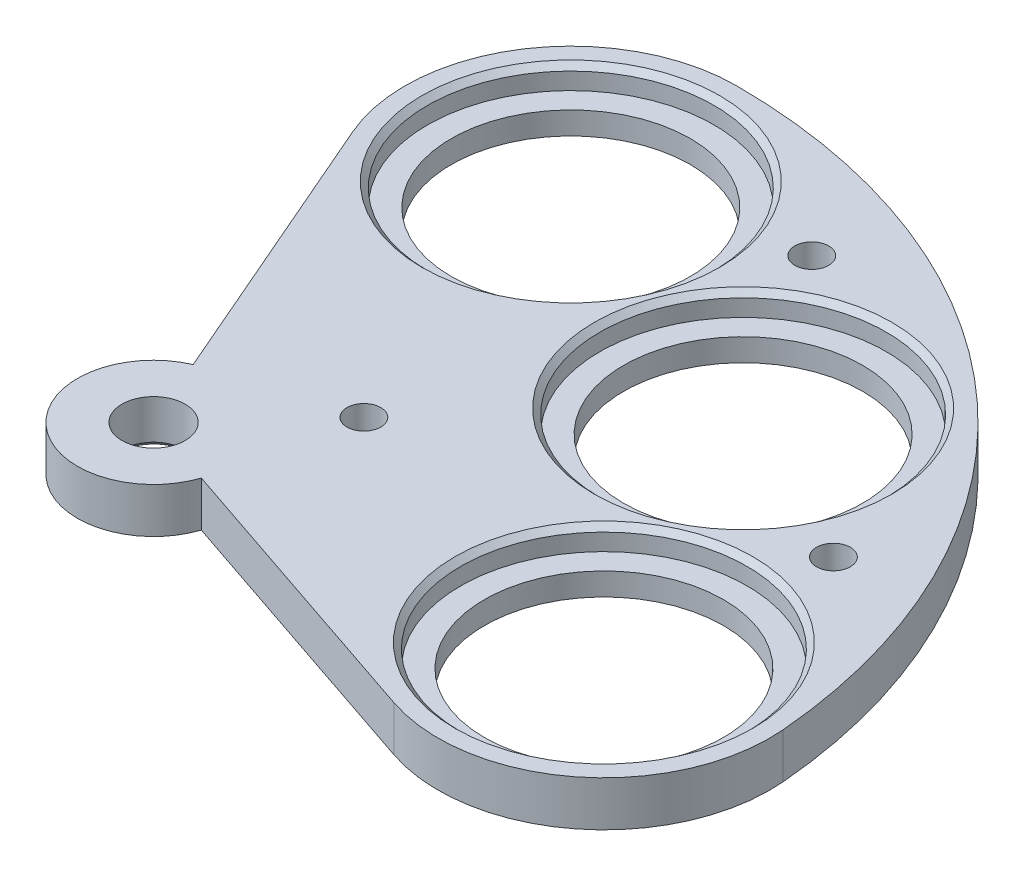
ISO-10303-21;
HEADER;
FILE_DESCRIPTION(('STEP AP214'),'2;1');
FILE_NAME('part.step','',(''),(''),'','','');
FILE_SCHEMA(('AUTOMOTIVE_DESIGN { 1 0 10303 214 1 1 1 1 }'));
ENDSEC;
DATA;
#1=APPLICATION_CONTEXT('core data for automotive mechanical design processes');
#2=APPLICATION_PROTOCOL_DEFINITION('international standard','automotive_design',2000,#1);
#3=PRODUCT_CONTEXT('',#1,'mechanical');
#4=PRODUCT('Part','Part','',(#3));
#5=PRODUCT_RELATED_PRODUCT_CATEGORY('part','',(#4));
#6=PRODUCT_DEFINITION_FORMATION('','',#4);
#7=PRODUCT_DEFINITION_CONTEXT('part definition',#1,'design');
#8=PRODUCT_DEFINITION('design','',#6,#7);
#9=PRODUCT_DEFINITION_SHAPE('','',#8);
#10=(LENGTH_UNIT() NAMED_UNIT(*) SI_UNIT(.MILLI.,.METRE.));
#11=(NAMED_UNIT(*) PLANE_ANGLE_UNIT() SI_UNIT($,.RADIAN.));
#12=(NAMED_UNIT(*) SI_UNIT($,.STERADIAN.) SOLID_ANGLE_UNIT());
#13=UNCERTAINTY_MEASURE_WITH_UNIT(LENGTH_MEASURE(1.E-05),#10,'distance_accuracy_value','');
#14=(GEOMETRIC_REPRESENTATION_CONTEXT(3) GLOBAL_UNCERTAINTY_ASSIGNED_CONTEXT((#13)) GLOBAL_UNIT_ASSIGNED_CONTEXT((#10,
#11,#12)) REPRESENTATION_CONTEXT('',''));
#15=CARTESIAN_POINT('',(0.,0.,0.));
#16=DIRECTION('',(0.,0.,1.));
#17=DIRECTION('',(1.,0.,0.));
#18=AXIS2_PLACEMENT_3D('',#15,#16,#17);
#19=CARTESIAN_POINT('',(-13.4900423709563,4.,-31.1597297297297));
#20=DIRECTION('',(0.917689957207914,0.,-0.397297297297297));
#21=DIRECTION('',(-0.397297297297297,0.,-0.917689957207914));
#22=AXIS2_PLACEMENT_3D('',#19,#20,#21);
#23=PLANE('',#22);
#24=DIRECTION('',(0.,-1.,0.));
#25=VECTOR('',#24,1.);
#26=CARTESIAN_POINT('',(-2.68175675675676,23.0918830920368,-6.19440721115342));
#27=LINE('',#26,#25);
#28=CARTESIAN_POINT('',(-2.68175675675676,4.,-6.19440721115342));
#29=VERTEX_POINT('',#28);
#30=CARTESIAN_POINT('',(-2.68175675675676,0.,-6.19440721115342));
#31=VERTEX_POINT('',#30);
#32=EDGE_CURVE('E106',#29,#31,#27,.T.);
#33=ORIENTED_EDGE('',*,*,#32,.F.);
#34=DIRECTION('',(0.397297297297297,0.,0.917689957207914));
#35=VECTOR('',#34,1.);
#36=CARTESIAN_POINT('',(-13.4900423709563,4.,-31.1597297297297));
#37=LINE('',#36,#35);
#38=CARTESIAN_POINT('',(-13.4900423709563,4.,-31.1597297297297));
#39=VERTEX_POINT('',#38);
#40=EDGE_CURVE('E91',#39,#29,#37,.T.);
#41=ORIENTED_EDGE('',*,*,#40,.F.);
#42=DIRECTION('',(0.,-1.,0.));
#43=VECTOR('',#42,1.);
#44=CARTESIAN_POINT('',(-13.4900423709563,4.,-31.1597297297297));
#45=LINE('',#44,#43);
#46=CARTESIAN_POINT('',(-13.4900423709563,0.,-31.1597297297297));
#47=VERTEX_POINT('',#46);
#48=EDGE_CURVE('E137',#39,#47,#45,.T.);
#49=ORIENTED_EDGE('',*,*,#48,.T.);
#50=DIRECTION('',(0.397297297297297,0.,0.917689957207914));
#51=VECTOR('',#50,1.);
#52=CARTESIAN_POINT('',(-13.4900423709563,0.,-31.1597297297297));
#53=LINE('',#52,#51);
#54=EDGE_CURVE('E122',#47,#31,#53,.T.);
#55=ORIENTED_EDGE('',*,*,#54,.T.);
#56=EDGE_LOOP('',(#33,#41,#49,#55));
#57=FACE_BOUND('',#56,.T.);
#58=ADVANCED_FACE('F39',(#57),#23,.F.);
#59=CARTESIAN_POINT('',(0.,4.,0.));
#60=DIRECTION('',(0.319970753509013,0.,-0.947427420385791));
#61=DIRECTION('',(-0.947427420385791,0.,-0.319970753509013));
#62=AXIS2_PLACEMENT_3D('',#59,#60,#61);
#63=PLANE('',#62);
#64=DIRECTION('',(0.,-1.,0.));
#65=VECTOR('',#64,1.);
#66=CARTESIAN_POINT('',(6.39513508760409,23.0918830920368,2.15980258618584));
#67=LINE('',#66,#65);
#68=CARTESIAN_POINT('',(6.39513508760409,0.,2.15980258618584));
#69=VERTEX_POINT('',#68);
#70=CARTESIAN_POINT('',(6.39513508760409,4.,2.15980258618584));
#71=VERTEX_POINT('',#70);
#72=EDGE_CURVE('E104',#69,#71,#67,.F.);
#73=ORIENTED_EDGE('',*,*,#72,.F.);
#74=DIRECTION('',(0.947427420385791,0.,0.319970753509013));
#75=VECTOR('',#74,1.);
#76=CARTESIAN_POINT('',(0.,0.,0.));
#77=LINE('',#76,#75);
#78=CARTESIAN_POINT('',(32.1694512682433,0.,10.8644560425324));
#79=VERTEX_POINT('',#78);
#80=EDGE_CURVE('E115',#69,#79,#77,.T.);
#81=ORIENTED_EDGE('',*,*,#80,.T.);
#82=DIRECTION('',(0.,-1.,0.));
#83=VECTOR('',#82,1.);
#84=CARTESIAN_POINT('',(32.1694512682433,4.,10.8644560425324));
#85=LINE('',#84,#83);
#86=CARTESIAN_POINT('',(32.1694512682433,4.,10.8644560425324));
#87=VERTEX_POINT('',#86);
#88=EDGE_CURVE('E135',#87,#79,#85,.T.);
#89=ORIENTED_EDGE('',*,*,#88,.F.);
#90=DIRECTION('',(0.947427420385791,0.,0.319970753509013));
#91=VECTOR('',#90,1.);
#92=CARTESIAN_POINT('',(0.,4.,0.));
#93=LINE('',#92,#91);
#94=EDGE_CURVE('E117',#71,#87,#93,.T.);
#95=ORIENTED_EDGE('',*,*,#94,.F.);
#96=EDGE_LOOP('',(#73,#81,#89,#95));
#97=FACE_BOUND('',#96,.T.);
#98=ADVANCED_FACE('F113',(#97),#63,.F.);
#99=CARTESIAN_POINT('',(0.,4.,-37.));
#100=DIRECTION('',(0.,-1.,0.));
#101=DIRECTION('',(0.,0.,-1.));
#102=AXIS2_PLACEMENT_3D('',#99,#100,#101);
#103=CYLINDRICAL_SURFACE('',#102,14.7);
#104=CARTESIAN_POINT('',(0.,0.,-37.));
#105=DIRECTION('',(0.,1.,0.));
#106=DIRECTION('',(0.,0.,1.));
#107=AXIS2_PLACEMENT_3D('',#104,#105,#106);
#108=CIRCLE('',#107,14.7);
#109=CARTESIAN_POINT('',(0.,0.,-51.7));
#110=VERTEX_POINT('',#109);
#111=EDGE_CURVE('E125',#110,#47,#108,.T.);
#112=ORIENTED_EDGE('',*,*,#111,.T.);
#113=ORIENTED_EDGE('',*,*,#48,.F.);
#114=CARTESIAN_POINT('',(0.,4.,-37.));
#115=DIRECTION('',(0.,1.,0.));
#116=DIRECTION('',(0.,0.,1.));
#117=AXIS2_PLACEMENT_3D('',#114,#115,#116);
#118=CIRCLE('',#117,14.7);
#119=CARTESIAN_POINT('',(0.,4.,-51.7));
#120=VERTEX_POINT('',#119);
#121=EDGE_CURVE('E130',#120,#39,#118,.T.);
#122=ORIENTED_EDGE('',*,*,#121,.F.);
#123=DIRECTION('',(0.,-1.,0.));
#124=VECTOR('',#123,1.);
#125=CARTESIAN_POINT('',(0.,4.,-51.7));
#126=LINE('',#125,#124);
#127=EDGE_CURVE('E131',#120,#110,#126,.T.);
#128=ORIENTED_EDGE('',*,*,#127,.T.);
#129=EDGE_LOOP('',(#112,#113,#122,#128));
#130=FACE_BOUND('',#129,.T.);
#131=ADVANCED_FACE('F186',(#130),#103,.T.);
#132=CARTESIAN_POINT('',(36.8730213448258,4.,-3.06272703713877));
#133=DIRECTION('',(0.,-1.,0.));
#134=DIRECTION('',(0.,0.,-1.));
#135=AXIS2_PLACEMENT_3D('',#132,#133,#134);
#136=CYLINDRICAL_SURFACE('',#135,14.7);
#137=CARTESIAN_POINT('',(36.8730213448258,0.,-3.06272703713877));
#138=DIRECTION('',(0.,1.,0.));
#139=DIRECTION('',(0.,0.,1.));
#140=AXIS2_PLACEMENT_3D('',#137,#138,#139);
#141=CIRCLE('',#140,14.7);
#142=CARTESIAN_POINT('',(51.5225730683106,0.,-4.27954021135336));
#143=VERTEX_POINT('',#142);
#144=EDGE_CURVE('E121',#79,#143,#141,.T.);
#145=ORIENTED_EDGE('',*,*,#144,.T.);
#146=DIRECTION('',(0.,-1.,0.));
#147=VECTOR('',#146,1.);
#148=CARTESIAN_POINT('',(51.5225730683106,4.,-4.27954021135336));
#149=LINE('',#148,#147);
#150=CARTESIAN_POINT('',(51.5225730683106,4.,-4.27954021135336));
#151=VERTEX_POINT('',#150);
#152=EDGE_CURVE('E133',#151,#143,#149,.T.);
#153=ORIENTED_EDGE('',*,*,#152,.F.);
#154=CARTESIAN_POINT('',(36.8730213448258,4.,-3.06272703713877));
#155=DIRECTION('',(0.,1.,0.));
#156=DIRECTION('',(0.,0.,1.));
#157=AXIS2_PLACEMENT_3D('',#154,#155,#156);
#158=CIRCLE('',#157,14.7);
#159=EDGE_CURVE('E243',#87,#151,#158,.T.);
#160=ORIENTED_EDGE('',*,*,#159,.F.);
#161=ORIENTED_EDGE('',*,*,#88,.T.);
#162=EDGE_LOOP('',(#145,#153,#160,#161));
#163=FACE_BOUND('',#162,.T.);
#164=ADVANCED_FACE('F192',(#163),#136,.T.);
#165=CARTESIAN_POINT('',(0.,4.,0.));
#166=DIRECTION('',(0.,-1.,0.));
#167=DIRECTION('',(0.,0.,-1.));
#168=AXIS2_PLACEMENT_3D('',#165,#166,#167);
#169=CYLINDRICAL_SURFACE('',#168,51.7);
#170=CARTESIAN_POINT('',(0.,0.,0.));
#171=DIRECTION('',(0.,1.,0.));
#172=DIRECTION('',(0.,0.,-1.));
#173=AXIS2_PLACEMENT_3D('',#170,#171,#172);
#174=CIRCLE('',#173,51.7);
#175=EDGE_CURVE('E84',#143,#110,#174,.T.);
#176=ORIENTED_EDGE('',*,*,#175,.T.);
#177=ORIENTED_EDGE('',*,*,#127,.F.);
#178=CARTESIAN_POINT('',(0.,4.,0.));
#179=DIRECTION('',(0.,1.,0.));
#180=DIRECTION('',(0.,0.,-1.));
#181=AXIS2_PLACEMENT_3D('',#178,#179,#180);
#182=CIRCLE('',#181,51.7);
#183=EDGE_CURVE('E63',#151,#120,#182,.T.);
#184=ORIENTED_EDGE('',*,*,#183,.F.);
#185=ORIENTED_EDGE('',*,*,#152,.T.);
#186=EDGE_LOOP('',(#176,#177,#184,#185));
#187=FACE_BOUND('',#186,.T.);
#188=ADVANCED_FACE('F251',(#187),#169,.T.);
#189=CARTESIAN_POINT('',(0.,4.,-37.));
#190=DIRECTION('',(0.,1.,0.));
#191=DIRECTION('',(0.,0.,1.));
#192=AXIS2_PLACEMENT_3D('',#189,#190,#191);
#193=PLANE('',#192);
#194=CARTESIAN_POINT('',(36.8730213448258,4.,-3.06272703713877));
#195=DIRECTION('',(0.,1.,0.));
#196=DIRECTION('',(0.,0.,1.));
#197=AXIS2_PLACEMENT_3D('',#194,#195,#196);
#198=CIRCLE('',#197,13.2);
#199=CARTESIAN_POINT('',(36.8730213448258,4.,10.1372729628613));
#200=VERTEX_POINT('',#199);
#201=EDGE_CURVE('E159',#200,#200,#198,.F.);
#202=ORIENTED_EDGE('',*,*,#201,.T.);
#203=EDGE_LOOP('',(#202));
#204=FACE_BOUND('',#203,.T.);
#205=CARTESIAN_POINT('',(25.0567266380294,4.,-27.2242621605631));
#206=DIRECTION('',(0.,1.,0.));
#207=DIRECTION('',(0.,0.,1.));
#208=AXIS2_PLACEMENT_3D('',#205,#206,#207);
#209=CIRCLE('',#208,13.2);
#210=CARTESIAN_POINT('',(25.0567266380294,4.,-14.0242621605631));
#211=VERTEX_POINT('',#210);
#212=EDGE_CURVE('E156',#211,#211,#209,.F.);
#213=ORIENTED_EDGE('',*,*,#212,.T.);
#214=EDGE_LOOP('',(#213));
#215=FACE_BOUND('',#214,.T.);
#216=CARTESIAN_POINT('',(0.,4.,-37.));
#217=DIRECTION('',(0.,1.,0.));
#218=DIRECTION('',(0.,0.,1.));
#219=AXIS2_PLACEMENT_3D('',#216,#217,#218);
#220=CIRCLE('',#219,13.2);
#221=CARTESIAN_POINT('',(0.,4.,-23.8));
#222=VERTEX_POINT('',#221);
#223=EDGE_CURVE('E153',#222,#222,#220,.F.);
#224=ORIENTED_EDGE('',*,*,#223,.T.);
#225=EDGE_LOOP('',(#224));
#226=FACE_BOUND('',#225,.T.);
#227=CARTESIAN_POINT('',(16.3810596434213,4.,-41.9871870817381));
#228=DIRECTION('',(0.,-1.,0.));
#229=DIRECTION('',(0.,0.,-1.));
#230=AXIS2_PLACEMENT_3D('',#227,#228,#229);
#231=CIRCLE('',#230,1.50000000000001);
#232=CARTESIAN_POINT('',(16.3810596434213,4.,-43.4871870817381));
#233=VERTEX_POINT('',#232);
#234=EDGE_CURVE('E608',#233,#233,#231,.T.);
#235=ORIENTED_EDGE('',*,*,#234,.T.);
#236=EDGE_LOOP('',(#235));
#237=FACE_BOUND('',#236,.T.);
#238=CARTESIAN_POINT('',(40.4871278704658,4.,-19.8003906749022));
#239=DIRECTION('',(0.,-1.,0.));
#240=DIRECTION('',(0.,0.,-1.));
#241=AXIS2_PLACEMENT_3D('',#238,#239,#240);
#242=CIRCLE('',#241,1.50000000000002);
#243=CARTESIAN_POINT('',(40.4871278704658,4.,-21.3003906749022));
#244=VERTEX_POINT('',#243);
#245=EDGE_CURVE('E620',#244,#244,#242,.T.);
#246=ORIENTED_EDGE('',*,*,#245,.T.);
#247=EDGE_LOOP('',(#246));
#248=FACE_BOUND('',#247,.T.);
#249=CARTESIAN_POINT('',(8.939156530324,4.,-9.71243947349818));
#250=DIRECTION('',(0.,-1.,0.));
#251=DIRECTION('',(0.,0.,-1.));
#252=AXIS2_PLACEMENT_3D('',#249,#250,#251);
#253=CIRCLE('',#252,1.50000000000001);
#254=CARTESIAN_POINT('',(8.939156530324,4.,-11.2124394734982));
#255=VERTEX_POINT('',#254);
#256=EDGE_CURVE('E632',#255,#255,#253,.T.);
#257=ORIENTED_EDGE('',*,*,#256,.T.);
#258=EDGE_LOOP('',(#257));
#259=FACE_BOUND('',#258,.T.);
#260=CARTESIAN_POINT('',(0.,4.,0.));
#261=DIRECTION('',(0.,1.,0.));
#262=DIRECTION('',(0.,0.,1.));
#263=AXIS2_PLACEMENT_3D('',#260,#261,#262);
#264=CIRCLE('',#263,2.8);
#265=CARTESIAN_POINT('',(0.,4.,2.8));
#266=VERTEX_POINT('',#265);
#267=EDGE_CURVE('E110',#266,#266,#264,.T.);
#268=ORIENTED_EDGE('',*,*,#267,.F.);
#269=EDGE_LOOP('',(#268));
#270=FACE_BOUND('',#269,.T.);
#271=ORIENTED_EDGE('',*,*,#40,.T.);
#272=CARTESIAN_POINT('',(0.,4.,0.));
#273=DIRECTION('',(0.,1.,0.));
#274=DIRECTION('',(0.,0.,1.));
#275=AXIS2_PLACEMENT_3D('',#272,#273,#274);
#276=CIRCLE('',#275,6.75);
#277=EDGE_CURVE('E55',#29,#71,#276,.T.);
#278=ORIENTED_EDGE('',*,*,#277,.T.);
#279=ORIENTED_EDGE('',*,*,#94,.T.);
#280=ORIENTED_EDGE('',*,*,#159,.T.);
#281=ORIENTED_EDGE('',*,*,#183,.T.);
#282=ORIENTED_EDGE('',*,*,#121,.T.);
#283=EDGE_LOOP('',(#271,#278,#279,#280,#281,#282));
#284=FACE_BOUND('',#283,.T.);
#285=ADVANCED_FACE('F249',(#204,#215,#226,#237,#248,#259,#270,#284),#193,.T.);
#286=CARTESIAN_POINT('',(0.,0.,-37.));
#287=DIRECTION('',(0.,1.,0.));
#288=DIRECTION('',(0.,0.,1.));
#289=AXIS2_PLACEMENT_3D('',#286,#287,#288);
#290=PLANE('',#289);
#291=CARTESIAN_POINT('',(0.,0.,0.));
#292=DIRECTION('',(0.,1.,0.));
#293=DIRECTION('',(0.,0.,1.));
#294=AXIS2_PLACEMENT_3D('',#291,#292,#293);
#295=CIRCLE('',#294,3.3);
#296=CARTESIAN_POINT('',(0.,0.,3.3));
#297=VERTEX_POINT('',#296);
#298=EDGE_CURVE('E48',#297,#297,#295,.T.);
#299=ORIENTED_EDGE('',*,*,#298,.T.);
#300=EDGE_LOOP('',(#299));
#301=FACE_BOUND('',#300,.T.);
#302=CARTESIAN_POINT('',(16.3810596434213,0.,-41.9871870817381));
#303=DIRECTION('',(0.,-1.,0.));
#304=DIRECTION('',(0.,0.,-1.));
#305=AXIS2_PLACEMENT_3D('',#302,#303,#304);
#306=CIRCLE('',#305,2.75000000000001);
#307=CARTESIAN_POINT('',(16.3810596434213,0.,-44.7371870817381));
#308=VERTEX_POINT('',#307);
#309=EDGE_CURVE('E601',#308,#308,#306,.T.);
#310=ORIENTED_EDGE('',*,*,#309,.F.);
#311=EDGE_LOOP('',(#310));
#312=FACE_BOUND('',#311,.T.);
#313=CARTESIAN_POINT('',(40.4871278704658,0.,-19.8003906749022));
#314=DIRECTION('',(0.,-1.,0.));
#315=DIRECTION('',(0.,0.,-1.));
#316=AXIS2_PLACEMENT_3D('',#313,#314,#315);
#317=CIRCLE('',#316,2.75000000000002);
#318=CARTESIAN_POINT('',(40.4871278704658,0.,-22.5503906749022));
#319=VERTEX_POINT('',#318);
#320=EDGE_CURVE('E611',#319,#319,#317,.T.);
#321=ORIENTED_EDGE('',*,*,#320,.F.);
#322=EDGE_LOOP('',(#321));
#323=FACE_BOUND('',#322,.T.);
#324=CARTESIAN_POINT('',(8.939156530324,0.,-9.71243947349818));
#325=DIRECTION('',(0.,-1.,0.));
#326=DIRECTION('',(0.,0.,-1.));
#327=AXIS2_PLACEMENT_3D('',#324,#325,#326);
#328=CIRCLE('',#327,2.75000000000001);
#329=CARTESIAN_POINT('',(8.939156530324,0.,-12.4624394734982));
#330=VERTEX_POINT('',#329);
#331=EDGE_CURVE('E623',#330,#330,#328,.T.);
#332=ORIENTED_EDGE('',*,*,#331,.F.);
#333=EDGE_LOOP('',(#332));
#334=FACE_BOUND('',#333,.T.);
#335=CARTESIAN_POINT('',(0.,0.,-37.));
#336=DIRECTION('',(0.,1.,0.));
#337=DIRECTION('',(0.,0.,1.));
#338=AXIS2_PLACEMENT_3D('',#335,#336,#337);
#339=CIRCLE('',#338,10.6);
#340=CARTESIAN_POINT('',(0.,0.,-26.4));
#341=VERTEX_POINT('',#340);
#342=EDGE_CURVE('E144',#341,#341,#339,.T.);
#343=ORIENTED_EDGE('',*,*,#342,.T.);
#344=EDGE_LOOP('',(#343));
#345=FACE_BOUND('',#344,.T.);
#346=CARTESIAN_POINT('',(25.0567266380294,0.,-27.2242621605631));
#347=DIRECTION('',(0.,1.,0.));
#348=DIRECTION('',(0.,0.,1.));
#349=AXIS2_PLACEMENT_3D('',#346,#347,#348);
#350=CIRCLE('',#349,10.6);
#351=CARTESIAN_POINT('',(25.0567266380294,0.,-16.6242621605631));
#352=VERTEX_POINT('',#351);
#353=EDGE_CURVE('E638',#352,#352,#350,.T.);
#354=ORIENTED_EDGE('',*,*,#353,.T.);
#355=EDGE_LOOP('',(#354));
#356=FACE_BOUND('',#355,.T.);
#357=CARTESIAN_POINT('',(36.8730213448258,0.,-3.06272703713877));
#358=DIRECTION('',(0.,1.,0.));
#359=DIRECTION('',(0.,0.,1.));
#360=AXIS2_PLACEMENT_3D('',#357,#358,#359);
#361=CIRCLE('',#360,10.6);
#362=CARTESIAN_POINT('',(36.8730213448258,0.,7.53727296286123));
#363=VERTEX_POINT('',#362);
#364=EDGE_CURVE('E635',#363,#363,#361,.T.);
#365=ORIENTED_EDGE('',*,*,#364,.T.);
#366=EDGE_LOOP('',(#365));
#367=FACE_BOUND('',#366,.T.);
#368=ORIENTED_EDGE('',*,*,#80,.F.);
#369=CARTESIAN_POINT('',(0.,0.,0.));
#370=DIRECTION('',(0.,1.,0.));
#371=DIRECTION('',(0.,0.,1.));
#372=AXIS2_PLACEMENT_3D('',#369,#370,#371);
#373=CIRCLE('',#372,6.75);
#374=EDGE_CURVE('E101',#31,#69,#373,.T.);
#375=ORIENTED_EDGE('',*,*,#374,.F.);
#376=ORIENTED_EDGE('',*,*,#54,.F.);
#377=ORIENTED_EDGE('',*,*,#111,.F.);
#378=ORIENTED_EDGE('',*,*,#175,.F.);
#379=ORIENTED_EDGE('',*,*,#144,.F.);
#380=EDGE_LOOP('',(#368,#375,#376,#377,#378,#379));
#381=FACE_BOUND('',#380,.T.);
#382=ADVANCED_FACE('F120',(#301,#312,#323,#334,#345,#356,#367,#381),#290,.F.);
#383=CARTESIAN_POINT('',(0.,23.0918830920368,0.));
#384=DIRECTION('',(0.,-1.,0.));
#385=DIRECTION('',(0.,0.,-1.));
#386=AXIS2_PLACEMENT_3D('',#383,#384,#385);
#387=CYLINDRICAL_SURFACE('',#386,6.75);
#388=ORIENTED_EDGE('',*,*,#277,.F.);
#389=ORIENTED_EDGE('',*,*,#32,.T.);
#390=ORIENTED_EDGE('',*,*,#374,.T.);
#391=ORIENTED_EDGE('',*,*,#72,.T.);
#392=EDGE_LOOP('',(#388,#389,#390,#391));
#393=FACE_BOUND('',#392,.T.);
#394=ADVANCED_FACE('F103',(#393),#387,.T.);
#395=CARTESIAN_POINT('',(0.,4.,0.));
#396=DIRECTION('',(0.,-1.,0.));
#397=DIRECTION('',(0.,0.,-1.));
#398=AXIS2_PLACEMENT_3D('',#395,#396,#397);
#399=CYLINDRICAL_SURFACE('',#398,2.8);
#400=CARTESIAN_POINT('',(0.,0.500000000000009,0.));
#401=DIRECTION('',(0.,1.,0.));
#402=DIRECTION('',(0.,0.,1.));
#403=AXIS2_PLACEMENT_3D('',#400,#401,#402);
#404=CIRCLE('',#403,2.8);
#405=CARTESIAN_POINT('',(0.,0.500000000000009,2.8));
#406=VERTEX_POINT('',#405);
#407=EDGE_CURVE('E11',#406,#406,#404,.F.);
#408=ORIENTED_EDGE('',*,*,#407,.T.);
#409=EDGE_LOOP('',(#408));
#410=FACE_BOUND('',#409,.T.);
#411=ORIENTED_EDGE('',*,*,#267,.T.);
#412=EDGE_LOOP('',(#411));
#413=FACE_BOUND('',#412,.T.);
#414=ADVANCED_FACE('F298',(#410,#413),#399,.F.);
#415=CARTESIAN_POINT('',(36.8730213448258,2.,-3.06272703713877));
#416=DIRECTION('',(0.,1.,0.));
#417=DIRECTION('',(0.,0.,1.));
#418=AXIS2_PLACEMENT_3D('',#415,#416,#417);
#419=CYLINDRICAL_SURFACE('',#418,12.7);
#420=CARTESIAN_POINT('',(36.8730213448258,3.49999999999999,-3.06272703713877));
#421=DIRECTION('',(0.,1.,0.));
#422=DIRECTION('',(0.,0.,1.));
#423=AXIS2_PLACEMENT_3D('',#420,#421,#422);
#424=CIRCLE('',#423,12.7);
#425=CARTESIAN_POINT('',(36.8730213448258,3.49999999999999,9.63727296286126));
#426=VERTEX_POINT('',#425);
#427=EDGE_CURVE('E139',#426,#426,#424,.T.);
#428=ORIENTED_EDGE('',*,*,#427,.T.);
#429=EDGE_LOOP('',(#428));
#430=FACE_BOUND('',#429,.T.);
#431=CARTESIAN_POINT('',(36.8730213448258,2.,-3.06272703713877));
#432=DIRECTION('',(0.,1.,0.));
#433=DIRECTION('',(0.,0.,1.));
#434=AXIS2_PLACEMENT_3D('',#431,#432,#433);
#435=CIRCLE('',#434,12.7);
#436=CARTESIAN_POINT('',(36.8730213448258,2.,9.63727296286126));
#437=VERTEX_POINT('',#436);
#438=EDGE_CURVE('E228',#437,#437,#435,.T.);
#439=ORIENTED_EDGE('',*,*,#438,.F.);
#440=EDGE_LOOP('',(#439));
#441=FACE_BOUND('',#440,.T.);
#442=ADVANCED_FACE('F311',(#430,#441),#419,.F.);
#443=CARTESIAN_POINT('',(36.8730213448258,2.,-3.06272703713877));
#444=DIRECTION('',(0.,1.,0.));
#445=DIRECTION('',(0.,0.,1.));
#446=AXIS2_PLACEMENT_3D('',#443,#444,#445);
#447=PLANE('',#446);
#448=CARTESIAN_POINT('',(36.8730213448258,2.,-3.06272703713877));
#449=DIRECTION('',(0.,1.,0.));
#450=DIRECTION('',(0.,0.,1.));
#451=AXIS2_PLACEMENT_3D('',#448,#449,#450);
#452=CIRCLE('',#451,10.6);
#453=CARTESIAN_POINT('',(36.8730213448258,2.,7.53727296286123));
#454=VERTEX_POINT('',#453);
#455=EDGE_CURVE('E147',#454,#454,#452,.F.);
#456=ORIENTED_EDGE('',*,*,#455,.T.);
#457=EDGE_LOOP('',(#456));
#458=FACE_BOUND('',#457,.T.);
#459=ORIENTED_EDGE('',*,*,#438,.T.);
#460=EDGE_LOOP('',(#459));
#461=FACE_BOUND('',#460,.T.);
#462=ADVANCED_FACE('F305',(#458,#461),#447,.T.);
#463=CARTESIAN_POINT('',(0.,2.,-37.));
#464=DIRECTION('',(0.,1.,0.));
#465=DIRECTION('',(0.,0.,1.));
#466=AXIS2_PLACEMENT_3D('',#463,#464,#465);
#467=CYLINDRICAL_SURFACE('',#466,12.7);
#468=CARTESIAN_POINT('',(0.,3.49999999999998,-37.));
#469=DIRECTION('',(0.,1.,0.));
#470=DIRECTION('',(0.,0.,1.));
#471=AXIS2_PLACEMENT_3D('',#468,#469,#470);
#472=CIRCLE('',#471,12.7);
#473=CARTESIAN_POINT('',(0.,3.49999999999998,-24.3));
#474=VERTEX_POINT('',#473);
#475=EDGE_CURVE('E165',#474,#474,#472,.T.);
#476=ORIENTED_EDGE('',*,*,#475,.T.);
#477=EDGE_LOOP('',(#476));
#478=FACE_BOUND('',#477,.T.);
#479=CARTESIAN_POINT('',(0.,2.,-37.));
#480=DIRECTION('',(0.,1.,0.));
#481=DIRECTION('',(0.,0.,1.));
#482=AXIS2_PLACEMENT_3D('',#479,#480,#481);
#483=CIRCLE('',#482,12.7);
#484=CARTESIAN_POINT('',(0.,2.,-24.3));
#485=VERTEX_POINT('',#484);
#486=EDGE_CURVE('E150',#485,#485,#483,.T.);
#487=ORIENTED_EDGE('',*,*,#486,.F.);
#488=EDGE_LOOP('',(#487));
#489=FACE_BOUND('',#488,.T.);
#490=ADVANCED_FACE('F310',(#478,#489),#467,.F.);
#491=CARTESIAN_POINT('',(0.,2.,-37.));
#492=DIRECTION('',(0.,1.,0.));
#493=DIRECTION('',(0.,0.,1.));
#494=AXIS2_PLACEMENT_3D('',#491,#492,#493);
#495=PLANE('',#494);
#496=CARTESIAN_POINT('',(0.,2.,-37.));
#497=DIRECTION('',(0.,1.,0.));
#498=DIRECTION('',(0.,0.,1.));
#499=AXIS2_PLACEMENT_3D('',#496,#497,#498);
#500=CIRCLE('',#499,10.6);
#501=CARTESIAN_POINT('',(0.,2.,-26.4));
#502=VERTEX_POINT('',#501);
#503=EDGE_CURVE('E143',#502,#502,#500,.F.);
#504=ORIENTED_EDGE('',*,*,#503,.T.);
#505=EDGE_LOOP('',(#504));
#506=FACE_BOUND('',#505,.T.);
#507=ORIENTED_EDGE('',*,*,#486,.T.);
#508=EDGE_LOOP('',(#507));
#509=FACE_BOUND('',#508,.T.);
#510=ADVANCED_FACE('F222',(#506,#509),#495,.T.);
#511=CARTESIAN_POINT('',(25.0567266380294,2.,-27.2242621605631));
#512=DIRECTION('',(0.,1.,0.));
#513=DIRECTION('',(0.,0.,1.));
#514=AXIS2_PLACEMENT_3D('',#511,#512,#513);
#515=CYLINDRICAL_SURFACE('',#514,12.7);
#516=CARTESIAN_POINT('',(25.0567266380294,3.49999999999999,-27.2242621605631));
#517=DIRECTION('',(0.,1.,0.));
#518=DIRECTION('',(0.,0.,1.));
#519=AXIS2_PLACEMENT_3D('',#516,#517,#518);
#520=CIRCLE('',#519,12.7);
#521=CARTESIAN_POINT('',(25.0567266380294,3.49999999999999,-14.5242621605631));
#522=VERTEX_POINT('',#521);
#523=EDGE_CURVE('E162',#522,#522,#520,.T.);
#524=ORIENTED_EDGE('',*,*,#523,.T.);
#525=EDGE_LOOP('',(#524));
#526=FACE_BOUND('',#525,.T.);
#527=CARTESIAN_POINT('',(25.0567266380294,2.,-27.2242621605631));
#528=DIRECTION('',(0.,1.,0.));
#529=DIRECTION('',(0.,0.,1.));
#530=AXIS2_PLACEMENT_3D('',#527,#528,#529);
#531=CIRCLE('',#530,12.7);
#532=CARTESIAN_POINT('',(25.0567266380294,2.,-14.5242621605631));
#533=VERTEX_POINT('',#532);
#534=EDGE_CURVE('E226',#533,#533,#531,.T.);
#535=ORIENTED_EDGE('',*,*,#534,.F.);
#536=EDGE_LOOP('',(#535));
#537=FACE_BOUND('',#536,.T.);
#538=ADVANCED_FACE('F218',(#526,#537),#515,.F.);
#539=CARTESIAN_POINT('',(25.0567266380294,2.,-27.2242621605631));
#540=DIRECTION('',(0.,1.,0.));
#541=DIRECTION('',(0.,0.,1.));
#542=AXIS2_PLACEMENT_3D('',#539,#540,#541);
#543=PLANE('',#542);
#544=CARTESIAN_POINT('',(25.0567266380294,2.,-27.2242621605631));
#545=DIRECTION('',(0.,1.,0.));
#546=DIRECTION('',(0.,0.,1.));
#547=AXIS2_PLACEMENT_3D('',#544,#545,#546);
#548=CIRCLE('',#547,10.6);
#549=CARTESIAN_POINT('',(25.0567266380294,2.,-16.6242621605631));
#550=VERTEX_POINT('',#549);
#551=EDGE_CURVE('E140',#550,#550,#548,.F.);
#552=ORIENTED_EDGE('',*,*,#551,.T.);
#553=EDGE_LOOP('',(#552));
#554=FACE_BOUND('',#553,.T.);
#555=ORIENTED_EDGE('',*,*,#534,.T.);
#556=EDGE_LOOP('',(#555));
#557=FACE_BOUND('',#556,.T.);
#558=ADVANCED_FACE('F221',(#554,#557),#543,.T.);
#559=CARTESIAN_POINT('',(25.0567266380294,4.,-27.2242621605631));
#560=DIRECTION('',(0.,-1.,0.));
#561=DIRECTION('',(0.,0.,-1.));
#562=AXIS2_PLACEMENT_3D('',#559,#560,#561);
#563=CYLINDRICAL_SURFACE('',#562,10.6);
#564=ORIENTED_EDGE('',*,*,#551,.F.);
#565=EDGE_LOOP('',(#564));
#566=FACE_BOUND('',#565,.T.);
#567=ORIENTED_EDGE('',*,*,#353,.F.);
#568=EDGE_LOOP('',(#567));
#569=FACE_BOUND('',#568,.T.);
#570=ADVANCED_FACE('F337',(#566,#569),#563,.F.);
#571=CARTESIAN_POINT('',(0.,4.,-37.));
#572=DIRECTION('',(0.,-1.,0.));
#573=DIRECTION('',(0.,0.,-1.));
#574=AXIS2_PLACEMENT_3D('',#571,#572,#573);
#575=CYLINDRICAL_SURFACE('',#574,10.6);
#576=ORIENTED_EDGE('',*,*,#503,.F.);
#577=EDGE_LOOP('',(#576));
#578=FACE_BOUND('',#577,.T.);
#579=ORIENTED_EDGE('',*,*,#342,.F.);
#580=EDGE_LOOP('',(#579));
#581=FACE_BOUND('',#580,.T.);
#582=ADVANCED_FACE('F348',(#578,#581),#575,.F.);
#583=CARTESIAN_POINT('',(36.8730213448258,4.,-3.06272703713877));
#584=DIRECTION('',(0.,-1.,0.));
#585=DIRECTION('',(0.,0.,-1.));
#586=AXIS2_PLACEMENT_3D('',#583,#584,#585);
#587=CYLINDRICAL_SURFACE('',#586,10.6);
#588=ORIENTED_EDGE('',*,*,#455,.F.);
#589=EDGE_LOOP('',(#588));
#590=FACE_BOUND('',#589,.T.);
#591=ORIENTED_EDGE('',*,*,#364,.F.);
#592=EDGE_LOOP('',(#591));
#593=FACE_BOUND('',#592,.T.);
#594=ADVANCED_FACE('F359',(#590,#593),#587,.F.);
#595=CARTESIAN_POINT('',(8.939156530324,0.,-9.71243947349818));
#596=DIRECTION('',(0.,-1.,0.));
#597=DIRECTION('',(0.,0.,-1.));
#598=AXIS2_PLACEMENT_3D('',#595,#596,#597);
#599=CYLINDRICAL_SURFACE('',#598,1.50000000000001);
#600=ORIENTED_EDGE('',*,*,#256,.F.);
#601=EDGE_LOOP('',(#600));
#602=FACE_BOUND('',#601,.T.);
#603=CARTESIAN_POINT('',(8.939156530324,0.5,-9.71243947349818));
#604=DIRECTION('',(0.,-1.,0.));
#605=DIRECTION('',(0.,0.,-1.));
#606=AXIS2_PLACEMENT_3D('',#603,#604,#605);
#607=CIRCLE('',#606,1.50000000000001);
#608=CARTESIAN_POINT('',(8.939156530324,0.5,-11.2124394734982));
#609=VERTEX_POINT('',#608);
#610=EDGE_CURVE('E629',#609,#609,#607,.T.);
#611=ORIENTED_EDGE('',*,*,#610,.T.);
#612=EDGE_LOOP('',(#611));
#613=FACE_BOUND('',#612,.T.);
#614=ADVANCED_FACE('F370',(#602,#613),#599,.F.);
#615=CARTESIAN_POINT('',(10.439156530324,0.5,-9.71243947349818));
#616=DIRECTION('',(0.,1.,0.));
#617=DIRECTION('',(0.,0.,1.));
#618=AXIS2_PLACEMENT_3D('',#615,#616,#617);
#619=PLANE('',#618);
#620=ORIENTED_EDGE('',*,*,#610,.F.);
#621=EDGE_LOOP('',(#620));
#622=FACE_BOUND('',#621,.T.);
#623=CARTESIAN_POINT('',(8.939156530324,0.5,-9.71243947349818));
#624=DIRECTION('',(0.,-1.,0.));
#625=DIRECTION('',(0.,0.,-1.));
#626=AXIS2_PLACEMENT_3D('',#623,#624,#625);
#627=CIRCLE('',#626,2.75000000000001);
#628=CARTESIAN_POINT('',(8.939156530324,0.5,-12.4624394734982));
#629=VERTEX_POINT('',#628);
#630=EDGE_CURVE('E626',#629,#629,#627,.T.);
#631=ORIENTED_EDGE('',*,*,#630,.T.);
#632=EDGE_LOOP('',(#631));
#633=FACE_BOUND('',#632,.T.);
#634=ADVANCED_FACE('F381',(#622,#633),#619,.F.);
#635=CARTESIAN_POINT('',(8.939156530324,0.,-9.71243947349818));
#636=DIRECTION('',(0.,-1.,0.));
#637=DIRECTION('',(0.,0.,-1.));
#638=AXIS2_PLACEMENT_3D('',#635,#636,#637);
#639=CYLINDRICAL_SURFACE('',#638,2.75000000000001);
#640=ORIENTED_EDGE('',*,*,#630,.F.);
#641=EDGE_LOOP('',(#640));
#642=FACE_BOUND('',#641,.T.);
#643=ORIENTED_EDGE('',*,*,#331,.T.);
#644=EDGE_LOOP('',(#643));
#645=FACE_BOUND('',#644,.T.);
#646=ADVANCED_FACE('F392',(#642,#645),#639,.F.);
#647=CARTESIAN_POINT('',(40.4871278704658,0.,-19.8003906749022));
#648=DIRECTION('',(0.,-1.,0.));
#649=DIRECTION('',(0.,0.,-1.));
#650=AXIS2_PLACEMENT_3D('',#647,#648,#649);
#651=CYLINDRICAL_SURFACE('',#650,1.50000000000002);
#652=ORIENTED_EDGE('',*,*,#245,.F.);
#653=EDGE_LOOP('',(#652));
#654=FACE_BOUND('',#653,.T.);
#655=CARTESIAN_POINT('',(40.4871278704658,0.5,-19.8003906749022));
#656=DIRECTION('',(0.,-1.,0.));
#657=DIRECTION('',(0.,0.,-1.));
#658=AXIS2_PLACEMENT_3D('',#655,#656,#657);
#659=CIRCLE('',#658,1.50000000000002);
#660=CARTESIAN_POINT('',(40.4871278704658,0.5,-21.3003906749022));
#661=VERTEX_POINT('',#660);
#662=EDGE_CURVE('E617',#661,#661,#659,.T.);
#663=ORIENTED_EDGE('',*,*,#662,.T.);
#664=EDGE_LOOP('',(#663));
#665=FACE_BOUND('',#664,.T.);
#666=ADVANCED_FACE('F403',(#654,#665),#651,.F.);
#667=CARTESIAN_POINT('',(41.9871278704658,0.5,-19.8003906749022));
#668=DIRECTION('',(0.,1.,0.));
#669=DIRECTION('',(0.,0.,1.));
#670=AXIS2_PLACEMENT_3D('',#667,#668,#669);
#671=PLANE('',#670);
#672=ORIENTED_EDGE('',*,*,#662,.F.);
#673=EDGE_LOOP('',(#672));
#674=FACE_BOUND('',#673,.T.);
#675=CARTESIAN_POINT('',(40.4871278704658,0.5,-19.8003906749022));
#676=DIRECTION('',(0.,-1.,0.));
#677=DIRECTION('',(0.,0.,-1.));
#678=AXIS2_PLACEMENT_3D('',#675,#676,#677);
#679=CIRCLE('',#678,2.75000000000002);
#680=CARTESIAN_POINT('',(40.4871278704658,0.5,-22.5503906749022));
#681=VERTEX_POINT('',#680);
#682=EDGE_CURVE('E614',#681,#681,#679,.T.);
#683=ORIENTED_EDGE('',*,*,#682,.T.);
#684=EDGE_LOOP('',(#683));
#685=FACE_BOUND('',#684,.T.);
#686=ADVANCED_FACE('F414',(#674,#685),#671,.F.);
#687=CARTESIAN_POINT('',(40.4871278704658,0.,-19.8003906749022));
#688=DIRECTION('',(0.,-1.,0.));
#689=DIRECTION('',(0.,0.,-1.));
#690=AXIS2_PLACEMENT_3D('',#687,#688,#689);
#691=CYLINDRICAL_SURFACE('',#690,2.75000000000002);
#692=ORIENTED_EDGE('',*,*,#682,.F.);
#693=EDGE_LOOP('',(#692));
#694=FACE_BOUND('',#693,.T.);
#695=ORIENTED_EDGE('',*,*,#320,.T.);
#696=EDGE_LOOP('',(#695));
#697=FACE_BOUND('',#696,.T.);
#698=ADVANCED_FACE('F425',(#694,#697),#691,.F.);
#699=CARTESIAN_POINT('',(16.3810596434213,0.,-41.9871870817381));
#700=DIRECTION('',(0.,-1.,0.));
#701=DIRECTION('',(0.,0.,-1.));
#702=AXIS2_PLACEMENT_3D('',#699,#700,#701);
#703=CYLINDRICAL_SURFACE('',#702,1.50000000000001);
#704=ORIENTED_EDGE('',*,*,#234,.F.);
#705=EDGE_LOOP('',(#704));
#706=FACE_BOUND('',#705,.T.);
#707=CARTESIAN_POINT('',(16.3810596434213,0.5,-41.9871870817381));
#708=DIRECTION('',(0.,-1.,0.));
#709=DIRECTION('',(0.,0.,-1.));
#710=AXIS2_PLACEMENT_3D('',#707,#708,#709);
#711=CIRCLE('',#710,1.50000000000001);
#712=CARTESIAN_POINT('',(16.3810596434213,0.5,-43.4871870817381));
#713=VERTEX_POINT('',#712);
#714=EDGE_CURVE('E603',#713,#713,#711,.T.);
#715=ORIENTED_EDGE('',*,*,#714,.T.);
#716=EDGE_LOOP('',(#715));
#717=FACE_BOUND('',#716,.T.);
#718=ADVANCED_FACE('F436',(#706,#717),#703,.F.);
#719=CARTESIAN_POINT('',(17.8810596434213,0.5,-41.9871870817381));
#720=DIRECTION('',(0.,1.,0.));
#721=DIRECTION('',(0.,0.,1.));
#722=AXIS2_PLACEMENT_3D('',#719,#720,#721);
#723=PLANE('',#722);
#724=ORIENTED_EDGE('',*,*,#714,.F.);
#725=EDGE_LOOP('',(#724));
#726=FACE_BOUND('',#725,.T.);
#727=CARTESIAN_POINT('',(16.3810596434213,0.5,-41.9871870817381));
#728=DIRECTION('',(0.,-1.,0.));
#729=DIRECTION('',(0.,0.,-1.));
#730=AXIS2_PLACEMENT_3D('',#727,#728,#729);
#731=CIRCLE('',#730,2.75000000000001);
#732=CARTESIAN_POINT('',(16.3810596434213,0.5,-44.7371870817381));
#733=VERTEX_POINT('',#732);
#734=EDGE_CURVE('E598',#733,#733,#731,.T.);
#735=ORIENTED_EDGE('',*,*,#734,.T.);
#736=EDGE_LOOP('',(#735));
#737=FACE_BOUND('',#736,.T.);
#738=ADVANCED_FACE('F447',(#726,#737),#723,.F.);
#739=CARTESIAN_POINT('',(16.3810596434213,0.,-41.9871870817381));
#740=DIRECTION('',(0.,-1.,0.));
#741=DIRECTION('',(0.,0.,-1.));
#742=AXIS2_PLACEMENT_3D('',#739,#740,#741);
#743=CYLINDRICAL_SURFACE('',#742,2.75000000000001);
#744=ORIENTED_EDGE('',*,*,#734,.F.);
#745=EDGE_LOOP('',(#744));
#746=FACE_BOUND('',#745,.T.);
#747=ORIENTED_EDGE('',*,*,#309,.T.);
#748=EDGE_LOOP('',(#747));
#749=FACE_BOUND('',#748,.T.);
#750=ADVANCED_FACE('F201',(#746,#749),#743,.F.);
#751=CARTESIAN_POINT('',(36.8730213448258,3.49999999999999,-3.06272703713877));
#752=DIRECTION('',(0.,1.,0.));
#753=DIRECTION('',(0.,0.,1.));
#754=AXIS2_PLACEMENT_3D('',#751,#752,#753);
#755=CONICAL_SURFACE('',#754,12.7,0.785398163397447);
#756=ORIENTED_EDGE('',*,*,#201,.F.);
#757=EDGE_LOOP('',(#756));
#758=FACE_BOUND('',#757,.T.);
#759=ORIENTED_EDGE('',*,*,#427,.F.);
#760=EDGE_LOOP('',(#759));
#761=FACE_BOUND('',#760,.T.);
#762=ADVANCED_FACE('F195',(#758,#761),#755,.F.);
#763=CARTESIAN_POINT('',(25.0567266380294,3.49999999999999,-27.2242621605631));
#764=DIRECTION('',(0.,1.,0.));
#765=DIRECTION('',(0.,0.,1.));
#766=AXIS2_PLACEMENT_3D('',#763,#764,#765);
#767=CONICAL_SURFACE('',#766,12.7,0.785398163397447);
#768=ORIENTED_EDGE('',*,*,#212,.F.);
#769=EDGE_LOOP('',(#768));
#770=FACE_BOUND('',#769,.T.);
#771=ORIENTED_EDGE('',*,*,#523,.F.);
#772=EDGE_LOOP('',(#771));
#773=FACE_BOUND('',#772,.T.);
#774=ADVANCED_FACE('F178',(#770,#773),#767,.F.);
#775=CARTESIAN_POINT('',(0.,3.49999999999998,-37.));
#776=DIRECTION('',(0.,1.,0.));
#777=DIRECTION('',(0.,0.,1.));
#778=AXIS2_PLACEMENT_3D('',#775,#776,#777);
#779=CONICAL_SURFACE('',#778,12.7,0.785398163397452);
#780=ORIENTED_EDGE('',*,*,#223,.F.);
#781=EDGE_LOOP('',(#780));
#782=FACE_BOUND('',#781,.T.);
#783=ORIENTED_EDGE('',*,*,#475,.F.);
#784=EDGE_LOOP('',(#783));
#785=FACE_BOUND('',#784,.T.);
#786=ADVANCED_FACE('F173',(#782,#785),#779,.F.);
#787=CARTESIAN_POINT('',(0.,0.,0.));
#788=DIRECTION('',(0.,-1.,0.));
#789=DIRECTION('',(0.,0.,-1.));
#790=AXIS2_PLACEMENT_3D('',#787,#788,#789);
#791=CONICAL_SURFACE('',#790,3.3,0.785398163397444);
#792=ORIENTED_EDGE('',*,*,#407,.F.);
#793=EDGE_LOOP('',(#792));
#794=FACE_BOUND('',#793,.T.);
#795=ORIENTED_EDGE('',*,*,#298,.F.);
#796=EDGE_LOOP('',(#795));
#797=FACE_BOUND('',#796,.T.);
#798=ADVANCED_FACE('F42',(#794,#797),#791,.F.);
#799=CLOSED_SHELL('',(#58,#98,#131,#164,#188,#285,#382,#394,#414,#442,#462,#490,#510,#538,#558,
#570,#582,#594,#614,#634,#646,#666,#686,#698,#718,#738,#750,#762,#774,#786,#798));
#800=MANIFOLD_SOLID_BREP('B2',#799);
#801=ADVANCED_BREP_SHAPE_REPRESENTATION('',(#18,#800),#14);
#802=SHAPE_DEFINITION_REPRESENTATION(#9,#801);
ENDSEC;
END-ISO-10303-21;
